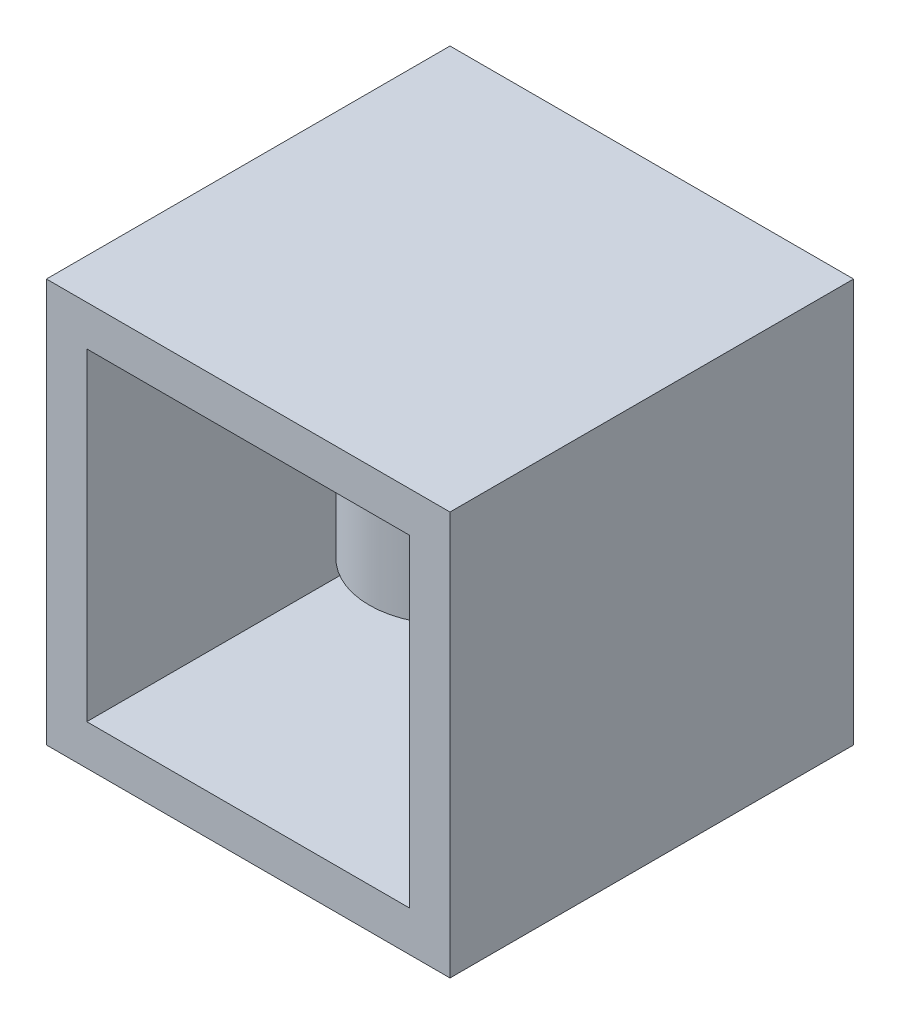
ISO-10303-21;
HEADER;
FILE_DESCRIPTION(('STEP AP214'),'2;1');
FILE_NAME('part.step','',(''),(''),'','','');
FILE_SCHEMA(('AUTOMOTIVE_DESIGN { 1 0 10303 214 1 1 1 1 }'));
ENDSEC;
DATA;
#1=APPLICATION_CONTEXT('core data for automotive mechanical design processes');
#2=APPLICATION_PROTOCOL_DEFINITION('international standard','automotive_design',2000,#1);
#3=PRODUCT_CONTEXT('',#1,'mechanical');
#4=PRODUCT('Part','Part','',(#3));
#5=PRODUCT_RELATED_PRODUCT_CATEGORY('part','',(#4));
#6=PRODUCT_DEFINITION_FORMATION('','',#4);
#7=PRODUCT_DEFINITION_CONTEXT('part definition',#1,'design');
#8=PRODUCT_DEFINITION('design','',#6,#7);
#9=PRODUCT_DEFINITION_SHAPE('','',#8);
#10=(LENGTH_UNIT() NAMED_UNIT(*) SI_UNIT(.MILLI.,.METRE.));
#11=(NAMED_UNIT(*) PLANE_ANGLE_UNIT() SI_UNIT($,.RADIAN.));
#12=(NAMED_UNIT(*) SI_UNIT($,.STERADIAN.) SOLID_ANGLE_UNIT());
#13=UNCERTAINTY_MEASURE_WITH_UNIT(LENGTH_MEASURE(1.E-05),#10,'distance_accuracy_value','');
#14=(GEOMETRIC_REPRESENTATION_CONTEXT(3) GLOBAL_UNCERTAINTY_ASSIGNED_CONTEXT((#13)) GLOBAL_UNIT_ASSIGNED_CONTEXT((#10,
#11,#12)) REPRESENTATION_CONTEXT('',''));
#15=CARTESIAN_POINT('',(0.,0.,0.));
#16=DIRECTION('',(0.,0.,1.));
#17=DIRECTION('',(1.,0.,0.));
#18=AXIS2_PLACEMENT_3D('',#15,#16,#17);
#19=CARTESIAN_POINT('',(0.,900.,1000.));
#20=DIRECTION('',(0.,1.,0.));
#21=DIRECTION('',(0.,0.,1.));
#22=AXIS2_PLACEMENT_3D('',#19,#20,#21);
#23=PLANE('',#22);
#24=CARTESIAN_POINT('',(500.,900.,500.));
#25=DIRECTION('',(0.,1.,0.));
#26=DIRECTION('',(0.,0.,1.));
#27=AXIS2_PLACEMENT_3D('',#24,#25,#26);
#28=CIRCLE('',#27,200.);
#29=CARTESIAN_POINT('',(500.,900.,700.));
#30=VERTEX_POINT('',#29);
#31=EDGE_CURVE('E11',#30,#30,#28,.F.);
#32=ORIENTED_EDGE('',*,*,#31,.F.);
#33=EDGE_LOOP('',(#32));
#34=FACE_BOUND('',#33,.T.);
#35=DIRECTION('',(1.,0.,0.));
#36=VECTOR('',#35,1.);
#37=CARTESIAN_POINT('',(0.,900.,0.));
#38=LINE('',#37,#36);
#39=CARTESIAN_POINT('',(100.,900.,0.));
#40=VERTEX_POINT('',#39);
#41=CARTESIAN_POINT('',(900.,900.,0.));
#42=VERTEX_POINT('',#41);
#43=EDGE_CURVE('E145',#40,#42,#38,.T.);
#44=ORIENTED_EDGE('',*,*,#43,.T.);
#45=DIRECTION('',(0.,0.,-1.));
#46=VECTOR('',#45,1.);
#47=CARTESIAN_POINT('',(900.,900.,1000.));
#48=LINE('',#47,#46);
#49=CARTESIAN_POINT('',(900.,900.,1000.));
#50=VERTEX_POINT('',#49);
#51=EDGE_CURVE('E44',#50,#42,#48,.T.);
#52=ORIENTED_EDGE('',*,*,#51,.F.);
#53=DIRECTION('',(1.,0.,0.));
#54=VECTOR('',#53,1.);
#55=CARTESIAN_POINT('',(0.,900.,1000.));
#56=LINE('',#55,#54);
#57=CARTESIAN_POINT('',(100.,900.,1000.));
#58=VERTEX_POINT('',#57);
#59=EDGE_CURVE('E113',#58,#50,#56,.T.);
#60=ORIENTED_EDGE('',*,*,#59,.F.);
#61=DIRECTION('',(0.,0.,-1.));
#62=VECTOR('',#61,1.);
#63=CARTESIAN_POINT('',(100.,900.,1000.));
#64=LINE('',#63,#62);
#65=EDGE_CURVE('E52',#58,#40,#64,.T.);
#66=ORIENTED_EDGE('',*,*,#65,.T.);
#67=EDGE_LOOP('',(#44,#52,#60,#66));
#68=FACE_BOUND('',#67,.T.);
#69=ADVANCED_FACE('F35',(#34,#68),#23,.F.);
#70=CARTESIAN_POINT('',(900.,-1.2490009027033E-13,1000.));
#71=DIRECTION('',(1.,0.,0.));
#72=DIRECTION('',(0.,1.,0.));
#73=AXIS2_PLACEMENT_3D('',#70,#71,#72);
#74=PLANE('',#73);
#75=DIRECTION('',(0.,-1.,0.));
#76=VECTOR('',#75,1.);
#77=CARTESIAN_POINT('',(900.,-1.2490009027033E-13,0.));
#78=LINE('',#77,#76);
#79=CARTESIAN_POINT('',(900.,100.,0.));
#80=VERTEX_POINT('',#79);
#81=EDGE_CURVE('E121',#42,#80,#78,.T.);
#82=ORIENTED_EDGE('',*,*,#81,.T.);
#83=DIRECTION('',(0.,0.,-1.));
#84=VECTOR('',#83,1.);
#85=CARTESIAN_POINT('',(900.,100.,1000.));
#86=LINE('',#85,#84);
#87=CARTESIAN_POINT('',(900.,100.,1000.));
#88=VERTEX_POINT('',#87);
#89=EDGE_CURVE('E119',#88,#80,#86,.T.);
#90=ORIENTED_EDGE('',*,*,#89,.F.);
#91=DIRECTION('',(0.,-1.,0.));
#92=VECTOR('',#91,1.);
#93=CARTESIAN_POINT('',(900.,-1.2490009027033E-13,1000.));
#94=LINE('',#93,#92);
#95=EDGE_CURVE('E107',#50,#88,#94,.T.);
#96=ORIENTED_EDGE('',*,*,#95,.F.);
#97=ORIENTED_EDGE('',*,*,#51,.T.);
#98=EDGE_LOOP('',(#82,#90,#96,#97));
#99=FACE_BOUND('',#98,.T.);
#100=ADVANCED_FACE('F120',(#99),#74,.F.);
#101=CARTESIAN_POINT('',(0.,100.,1000.));
#102=DIRECTION('',(0.,1.,0.));
#103=DIRECTION('',(0.,0.,1.));
#104=AXIS2_PLACEMENT_3D('',#101,#102,#103);
#105=PLANE('',#104);
#106=DIRECTION('',(1.,0.,0.));
#107=VECTOR('',#106,1.);
#108=CARTESIAN_POINT('',(0.,100.,0.));
#109=LINE('',#108,#107);
#110=CARTESIAN_POINT('',(100.,100.,0.));
#111=VERTEX_POINT('',#110);
#112=EDGE_CURVE('E148',#111,#80,#109,.T.);
#113=ORIENTED_EDGE('',*,*,#112,.F.);
#114=DIRECTION('',(0.,0.,-1.));
#115=VECTOR('',#114,1.);
#116=CARTESIAN_POINT('',(100.,100.,1000.));
#117=LINE('',#116,#115);
#118=CARTESIAN_POINT('',(100.,100.,1000.));
#119=VERTEX_POINT('',#118);
#120=EDGE_CURVE('E78',#119,#111,#117,.T.);
#121=ORIENTED_EDGE('',*,*,#120,.F.);
#122=DIRECTION('',(1.,0.,0.));
#123=VECTOR('',#122,1.);
#124=CARTESIAN_POINT('',(0.,100.,1000.));
#125=LINE('',#124,#123);
#126=EDGE_CURVE('E112',#119,#88,#125,.T.);
#127=ORIENTED_EDGE('',*,*,#126,.T.);
#128=ORIENTED_EDGE('',*,*,#89,.T.);
#129=EDGE_LOOP('',(#113,#121,#127,#128));
#130=FACE_BOUND('',#129,.T.);
#131=ADVANCED_FACE('F125',(#130),#105,.T.);
#132=CARTESIAN_POINT('',(0.,0.,1000.));
#133=DIRECTION('',(0.,1.,0.));
#134=DIRECTION('',(0.,0.,1.));
#135=AXIS2_PLACEMENT_3D('',#132,#133,#134);
#136=PLANE('',#135);
#137=DIRECTION('',(1.,0.,0.));
#138=VECTOR('',#137,1.);
#139=CARTESIAN_POINT('',(0.,0.,0.));
#140=LINE('',#139,#138);
#141=CARTESIAN_POINT('',(0.,0.,0.));
#142=VERTEX_POINT('',#141);
#143=CARTESIAN_POINT('',(1000.,0.,0.));
#144=VERTEX_POINT('',#143);
#145=EDGE_CURVE('E132',#142,#144,#140,.T.);
#146=ORIENTED_EDGE('',*,*,#145,.T.);
#147=DIRECTION('',(0.,0.,-1.));
#148=VECTOR('',#147,1.);
#149=CARTESIAN_POINT('',(1000.,0.,1000.));
#150=LINE('',#149,#148);
#151=CARTESIAN_POINT('',(1000.,0.,1000.));
#152=VERTEX_POINT('',#151);
#153=EDGE_CURVE('E155',#152,#144,#150,.T.);
#154=ORIENTED_EDGE('',*,*,#153,.F.);
#155=DIRECTION('',(1.,0.,0.));
#156=VECTOR('',#155,1.);
#157=CARTESIAN_POINT('',(0.,0.,1000.));
#158=LINE('',#157,#156);
#159=CARTESIAN_POINT('',(0.,0.,1000.));
#160=VERTEX_POINT('',#159);
#161=EDGE_CURVE('E153',#160,#152,#158,.T.);
#162=ORIENTED_EDGE('',*,*,#161,.F.);
#163=DIRECTION('',(0.,0.,-1.));
#164=VECTOR('',#163,1.);
#165=CARTESIAN_POINT('',(0.,0.,1000.));
#166=LINE('',#165,#164);
#167=EDGE_CURVE('E128',#160,#142,#166,.T.);
#168=ORIENTED_EDGE('',*,*,#167,.T.);
#169=EDGE_LOOP('',(#146,#154,#162,#168));
#170=FACE_BOUND('',#169,.T.);
#171=ADVANCED_FACE('F37',(#170),#136,.F.);
#172=CARTESIAN_POINT('',(1000.,0.,1000.));
#173=DIRECTION('',(-1.,0.,0.));
#174=DIRECTION('',(0.,0.,1.));
#175=AXIS2_PLACEMENT_3D('',#172,#173,#174);
#176=PLANE('',#175);
#177=DIRECTION('',(0.,1.,0.));
#178=VECTOR('',#177,1.);
#179=CARTESIAN_POINT('',(1000.,0.,0.));
#180=LINE('',#179,#178);
#181=CARTESIAN_POINT('',(1000.,1000.,0.));
#182=VERTEX_POINT('',#181);
#183=EDGE_CURVE('E135',#144,#182,#180,.T.);
#184=ORIENTED_EDGE('',*,*,#183,.T.);
#185=DIRECTION('',(0.,0.,-1.));
#186=VECTOR('',#185,1.);
#187=CARTESIAN_POINT('',(1000.,1000.,1000.));
#188=LINE('',#187,#186);
#189=CARTESIAN_POINT('',(1000.,1000.,1000.));
#190=VERTEX_POINT('',#189);
#191=EDGE_CURVE('E161',#190,#182,#188,.T.);
#192=ORIENTED_EDGE('',*,*,#191,.F.);
#193=DIRECTION('',(0.,1.,0.));
#194=VECTOR('',#193,1.);
#195=CARTESIAN_POINT('',(1000.,0.,1000.));
#196=LINE('',#195,#194);
#197=EDGE_CURVE('E91',#152,#190,#196,.T.);
#198=ORIENTED_EDGE('',*,*,#197,.F.);
#199=ORIENTED_EDGE('',*,*,#153,.T.);
#200=EDGE_LOOP('',(#184,#192,#198,#199));
#201=FACE_BOUND('',#200,.T.);
#202=ADVANCED_FACE('F163',(#201),#176,.F.);
#203=CARTESIAN_POINT('',(0.,1000.,1000.));
#204=DIRECTION('',(0.,1.,0.));
#205=DIRECTION('',(0.,0.,1.));
#206=AXIS2_PLACEMENT_3D('',#203,#204,#205);
#207=PLANE('',#206);
#208=DIRECTION('',(1.,0.,0.));
#209=VECTOR('',#208,1.);
#210=CARTESIAN_POINT('',(0.,1000.,0.));
#211=LINE('',#210,#209);
#212=CARTESIAN_POINT('',(0.,1000.,0.));
#213=VERTEX_POINT('',#212);
#214=EDGE_CURVE('E139',#213,#182,#211,.T.);
#215=ORIENTED_EDGE('',*,*,#214,.F.);
#216=DIRECTION('',(0.,0.,-1.));
#217=VECTOR('',#216,1.);
#218=CARTESIAN_POINT('',(0.,1000.,1000.));
#219=LINE('',#218,#217);
#220=CARTESIAN_POINT('',(0.,1000.,1000.));
#221=VERTEX_POINT('',#220);
#222=EDGE_CURVE('E159',#221,#213,#219,.T.);
#223=ORIENTED_EDGE('',*,*,#222,.F.);
#224=DIRECTION('',(1.,0.,0.));
#225=VECTOR('',#224,1.);
#226=CARTESIAN_POINT('',(0.,1000.,1000.));
#227=LINE('',#226,#225);
#228=EDGE_CURVE('E181',#221,#190,#227,.T.);
#229=ORIENTED_EDGE('',*,*,#228,.T.);
#230=ORIENTED_EDGE('',*,*,#191,.T.);
#231=EDGE_LOOP('',(#215,#223,#229,#230));
#232=FACE_BOUND('',#231,.T.);
#233=ADVANCED_FACE('F180',(#232),#207,.T.);
#234=CARTESIAN_POINT('',(0.,0.,1000.));
#235=DIRECTION('',(-1.,0.,0.));
#236=DIRECTION('',(0.,0.,1.));
#237=AXIS2_PLACEMENT_3D('',#234,#235,#236);
#238=PLANE('',#237);
#239=DIRECTION('',(0.,1.,0.));
#240=VECTOR('',#239,1.);
#241=CARTESIAN_POINT('',(0.,0.,0.));
#242=LINE('',#241,#240);
#243=EDGE_CURVE('E142',#142,#213,#242,.T.);
#244=ORIENTED_EDGE('',*,*,#243,.F.);
#245=ORIENTED_EDGE('',*,*,#167,.F.);
#246=DIRECTION('',(0.,1.,0.));
#247=VECTOR('',#246,1.);
#248=CARTESIAN_POINT('',(0.,0.,1000.));
#249=LINE('',#248,#247);
#250=EDGE_CURVE('E176',#160,#221,#249,.T.);
#251=ORIENTED_EDGE('',*,*,#250,.T.);
#252=ORIENTED_EDGE('',*,*,#222,.T.);
#253=EDGE_LOOP('',(#244,#245,#251,#252));
#254=FACE_BOUND('',#253,.T.);
#255=ADVANCED_FACE('F172',(#254),#238,.T.);
#256=CARTESIAN_POINT('',(100.,0.,1000.));
#257=DIRECTION('',(1.,0.,0.));
#258=DIRECTION('',(0.,1.,0.));
#259=AXIS2_PLACEMENT_3D('',#256,#257,#258);
#260=PLANE('',#259);
#261=DIRECTION('',(0.,-1.,0.));
#262=VECTOR('',#261,1.);
#263=CARTESIAN_POINT('',(100.,0.,0.));
#264=LINE('',#263,#262);
#265=EDGE_CURVE('E150',#40,#111,#264,.T.);
#266=ORIENTED_EDGE('',*,*,#265,.F.);
#267=ORIENTED_EDGE('',*,*,#65,.F.);
#268=DIRECTION('',(0.,-1.,0.));
#269=VECTOR('',#268,1.);
#270=CARTESIAN_POINT('',(100.,0.,1000.));
#271=LINE('',#270,#269);
#272=EDGE_CURVE('E126',#58,#119,#271,.T.);
#273=ORIENTED_EDGE('',*,*,#272,.T.);
#274=ORIENTED_EDGE('',*,*,#120,.T.);
#275=EDGE_LOOP('',(#266,#267,#273,#274));
#276=FACE_BOUND('',#275,.T.);
#277=ADVANCED_FACE('F201',(#276),#260,.T.);
#278=CARTESIAN_POINT('',(0.,0.,1000.));
#279=DIRECTION('',(0.,0.,1.));
#280=DIRECTION('',(1.,0.,0.));
#281=AXIS2_PLACEMENT_3D('',#278,#279,#280);
#282=PLANE('',#281);
#283=ORIENTED_EDGE('',*,*,#161,.T.);
#284=ORIENTED_EDGE('',*,*,#197,.T.);
#285=ORIENTED_EDGE('',*,*,#228,.F.);
#286=ORIENTED_EDGE('',*,*,#250,.F.);
#287=EDGE_LOOP('',(#283,#284,#285,#286));
#288=FACE_BOUND('',#287,.T.);
#289=ORIENTED_EDGE('',*,*,#59,.T.);
#290=ORIENTED_EDGE('',*,*,#95,.T.);
#291=ORIENTED_EDGE('',*,*,#126,.F.);
#292=ORIENTED_EDGE('',*,*,#272,.F.);
#293=EDGE_LOOP('',(#289,#290,#291,#292));
#294=FACE_BOUND('',#293,.T.);
#295=ADVANCED_FACE('F109',(#288,#294),#282,.T.);
#296=CARTESIAN_POINT('',(0.,0.,0.));
#297=DIRECTION('',(0.,0.,1.));
#298=DIRECTION('',(1.,0.,0.));
#299=AXIS2_PLACEMENT_3D('',#296,#297,#298);
#300=PLANE('',#299);
#301=ORIENTED_EDGE('',*,*,#145,.F.);
#302=ORIENTED_EDGE('',*,*,#243,.T.);
#303=ORIENTED_EDGE('',*,*,#214,.T.);
#304=ORIENTED_EDGE('',*,*,#183,.F.);
#305=EDGE_LOOP('',(#301,#302,#303,#304));
#306=FACE_BOUND('',#305,.T.);
#307=ORIENTED_EDGE('',*,*,#43,.F.);
#308=ORIENTED_EDGE('',*,*,#265,.T.);
#309=ORIENTED_EDGE('',*,*,#112,.T.);
#310=ORIENTED_EDGE('',*,*,#81,.F.);
#311=EDGE_LOOP('',(#307,#308,#309,#310));
#312=FACE_BOUND('',#311,.T.);
#313=ADVANCED_FACE('F169',(#306,#312),#300,.F.);
#314=CARTESIAN_POINT('',(500.,400.,500.));
#315=DIRECTION('',(0.,1.,0.));
#316=DIRECTION('',(0.,0.,1.));
#317=AXIS2_PLACEMENT_3D('',#314,#315,#316);
#318=CYLINDRICAL_SURFACE('',#317,200.);
#319=CARTESIAN_POINT('',(500.,400.,500.));
#320=DIRECTION('',(0.,-1.,0.));
#321=DIRECTION('',(0.,0.,-1.));
#322=AXIS2_PLACEMENT_3D('',#319,#320,#321);
#323=CIRCLE('',#322,200.);
#324=CARTESIAN_POINT('',(500.,400.,300.));
#325=VERTEX_POINT('',#324);
#326=EDGE_CURVE('E136',#325,#325,#323,.T.);
#327=ORIENTED_EDGE('',*,*,#326,.F.);
#328=EDGE_LOOP('',(#327));
#329=FACE_BOUND('',#328,.T.);
#330=ORIENTED_EDGE('',*,*,#31,.T.);
#331=EDGE_LOOP('',(#330));
#332=FACE_BOUND('',#331,.T.);
#333=ADVANCED_FACE('F193',(#329,#332),#318,.T.);
#334=CARTESIAN_POINT('',(500.,400.,500.));
#335=DIRECTION('',(0.,-1.,0.));
#336=DIRECTION('',(0.,0.,-1.));
#337=AXIS2_PLACEMENT_3D('',#334,#335,#336);
#338=PLANE('',#337);
#339=ORIENTED_EDGE('',*,*,#326,.T.);
#340=EDGE_LOOP('',(#339));
#341=FACE_BOUND('',#340,.T.);
#342=ADVANCED_FACE('F191',(#341),#338,.T.);
#343=CLOSED_SHELL('',(#69,#100,#131,#171,#202,#233,#255,#277,#295,#313,#333,#342));
#344=MANIFOLD_SOLID_BREP('B2',#343);
#345=ADVANCED_BREP_SHAPE_REPRESENTATION('',(#18,#344),#14);
#346=SHAPE_DEFINITION_REPRESENTATION(#9,#345);
ENDSEC;
END-ISO-10303-21;
